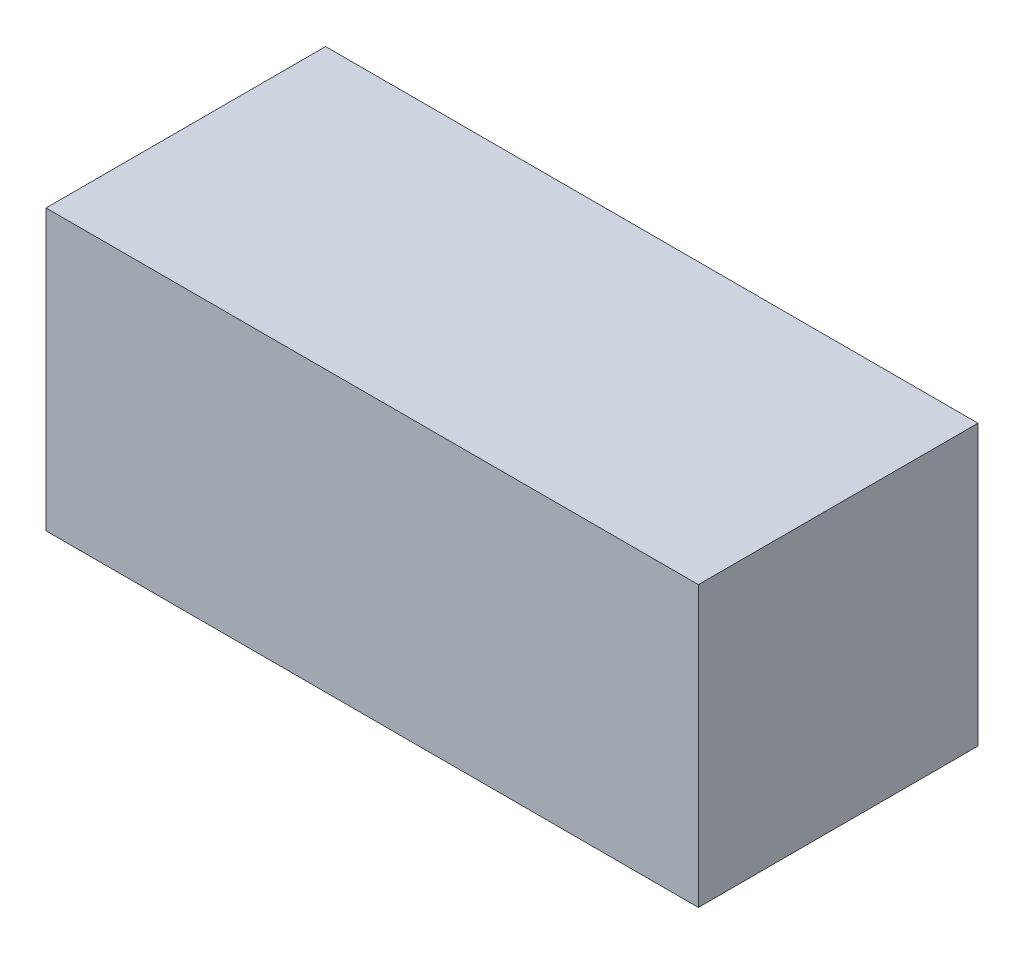
ISO-10303-21;
HEADER;
FILE_DESCRIPTION(('STEP AP214'),'2;1');
FILE_NAME('part.step','',(''),(''),'','','');
FILE_SCHEMA(('AUTOMOTIVE_DESIGN { 1 0 10303 214 1 1 1 1 }'));
ENDSEC;
DATA;
#1=APPLICATION_CONTEXT('core data for automotive mechanical design processes');
#2=APPLICATION_PROTOCOL_DEFINITION('international standard','automotive_design',2000,#1);
#3=PRODUCT_CONTEXT('',#1,'mechanical');
#4=PRODUCT('Part','Part','',(#3));
#5=PRODUCT_RELATED_PRODUCT_CATEGORY('part','',(#4));
#6=PRODUCT_DEFINITION_FORMATION('','',#4);
#7=PRODUCT_DEFINITION_CONTEXT('part definition',#1,'design');
#8=PRODUCT_DEFINITION('design','',#6,#7);
#9=PRODUCT_DEFINITION_SHAPE('','',#8);
#10=(LENGTH_UNIT() NAMED_UNIT(*) SI_UNIT(.MILLI.,.METRE.));
#11=(NAMED_UNIT(*) PLANE_ANGLE_UNIT() SI_UNIT($,.RADIAN.));
#12=(NAMED_UNIT(*) SI_UNIT($,.STERADIAN.) SOLID_ANGLE_UNIT());
#13=UNCERTAINTY_MEASURE_WITH_UNIT(LENGTH_MEASURE(1.E-05),#10,'distance_accuracy_value','');
#14=(GEOMETRIC_REPRESENTATION_CONTEXT(3) GLOBAL_UNCERTAINTY_ASSIGNED_CONTEXT((#13)) GLOBAL_UNIT_ASSIGNED_CONTEXT((#10,
#11,#12)) REPRESENTATION_CONTEXT('',''));
#15=CARTESIAN_POINT('',(0.,0.,0.));
#16=DIRECTION('',(0.,0.,1.));
#17=DIRECTION('',(1.,0.,0.));
#18=AXIS2_PLACEMENT_3D('',#15,#16,#17);
#19=CARTESIAN_POINT('',(88.9,0.,0.));
#20=DIRECTION('',(0.,0.,-1.));
#21=DIRECTION('',(-1.,0.,0.));
#22=AXIS2_PLACEMENT_3D('',#19,#20,#21);
#23=PLANE('',#22);
#24=DIRECTION('',(0.,-1.,0.));
#25=VECTOR('',#24,1.);
#26=CARTESIAN_POINT('',(0.,0.,0.));
#27=LINE('',#26,#25);
#28=CARTESIAN_POINT('',(0.,38.1,0.));
#29=VERTEX_POINT('',#28);
#30=CARTESIAN_POINT('',(0.,0.,0.));
#31=VERTEX_POINT('',#30);
#32=EDGE_CURVE('E96',#29,#31,#27,.T.);
#33=ORIENTED_EDGE('',*,*,#32,.T.);
#34=DIRECTION('',(-1.,0.,0.));
#35=VECTOR('',#34,1.);
#36=CARTESIAN_POINT('',(88.9,0.,0.));
#37=LINE('',#36,#35);
#38=CARTESIAN_POINT('',(88.9,0.,0.));
#39=VERTEX_POINT('',#38);
#40=EDGE_CURVE('E11',#39,#31,#37,.T.);
#41=ORIENTED_EDGE('',*,*,#40,.F.);
#42=DIRECTION('',(0.,-1.,0.));
#43=VECTOR('',#42,1.);
#44=CARTESIAN_POINT('',(88.9,0.,0.));
#45=LINE('',#44,#43);
#46=CARTESIAN_POINT('',(88.9,38.1,0.));
#47=VERTEX_POINT('',#46);
#48=EDGE_CURVE('E84',#47,#39,#45,.T.);
#49=ORIENTED_EDGE('',*,*,#48,.F.);
#50=DIRECTION('',(-1.,0.,0.));
#51=VECTOR('',#50,1.);
#52=CARTESIAN_POINT('',(88.9,38.1,0.));
#53=LINE('',#52,#51);
#54=EDGE_CURVE('E92',#47,#29,#53,.T.);
#55=ORIENTED_EDGE('',*,*,#54,.T.);
#56=EDGE_LOOP('',(#33,#41,#49,#55));
#57=FACE_BOUND('',#56,.T.);
#58=ADVANCED_FACE('F33',(#57),#23,.F.);
#59=CARTESIAN_POINT('',(88.9,0.,0.));
#60=DIRECTION('',(0.,1.,0.));
#61=DIRECTION('',(0.,0.,1.));
#62=AXIS2_PLACEMENT_3D('',#59,#60,#61);
#63=PLANE('',#62);
#64=DIRECTION('',(0.,0.,-1.));
#65=VECTOR('',#64,1.);
#66=CARTESIAN_POINT('',(0.,0.,0.));
#67=LINE('',#66,#65);
#68=CARTESIAN_POINT('',(0.,0.,-38.1));
#69=VERTEX_POINT('',#68);
#70=EDGE_CURVE('E88',#31,#69,#67,.T.);
#71=ORIENTED_EDGE('',*,*,#70,.T.);
#72=DIRECTION('',(-1.,0.,0.));
#73=VECTOR('',#72,1.);
#74=CARTESIAN_POINT('',(88.9,0.,-38.1));
#75=LINE('',#74,#73);
#76=CARTESIAN_POINT('',(88.9,0.,-38.1));
#77=VERTEX_POINT('',#76);
#78=EDGE_CURVE('E41',#77,#69,#75,.T.);
#79=ORIENTED_EDGE('',*,*,#78,.F.);
#80=DIRECTION('',(0.,0.,-1.));
#81=VECTOR('',#80,1.);
#82=CARTESIAN_POINT('',(88.9,0.,0.));
#83=LINE('',#82,#81);
#84=EDGE_CURVE('E79',#39,#77,#83,.T.);
#85=ORIENTED_EDGE('',*,*,#84,.F.);
#86=ORIENTED_EDGE('',*,*,#40,.T.);
#87=EDGE_LOOP('',(#71,#79,#85,#86));
#88=FACE_BOUND('',#87,.T.);
#89=ADVANCED_FACE('F87',(#88),#63,.F.);
#90=CARTESIAN_POINT('',(88.9,0.,-38.1));
#91=DIRECTION('',(0.,0.,1.));
#92=DIRECTION('',(1.,0.,0.));
#93=AXIS2_PLACEMENT_3D('',#90,#91,#92);
#94=PLANE('',#93);
#95=DIRECTION('',(0.,1.,0.));
#96=VECTOR('',#95,1.);
#97=CARTESIAN_POINT('',(0.,0.,-38.1));
#98=LINE('',#97,#96);
#99=CARTESIAN_POINT('',(0.,38.1,-38.1));
#100=VERTEX_POINT('',#99);
#101=EDGE_CURVE('E66',#69,#100,#98,.T.);
#102=ORIENTED_EDGE('',*,*,#101,.T.);
#103=DIRECTION('',(-1.,0.,0.));
#104=VECTOR('',#103,1.);
#105=CARTESIAN_POINT('',(88.9,38.1,-38.1));
#106=LINE('',#105,#104);
#107=CARTESIAN_POINT('',(88.9,38.1,-38.1));
#108=VERTEX_POINT('',#107);
#109=EDGE_CURVE('E89',#108,#100,#106,.T.);
#110=ORIENTED_EDGE('',*,*,#109,.F.);
#111=DIRECTION('',(0.,1.,0.));
#112=VECTOR('',#111,1.);
#113=CARTESIAN_POINT('',(88.9,0.,-38.1));
#114=LINE('',#113,#112);
#115=EDGE_CURVE('E82',#77,#108,#114,.T.);
#116=ORIENTED_EDGE('',*,*,#115,.F.);
#117=ORIENTED_EDGE('',*,*,#78,.T.);
#118=EDGE_LOOP('',(#102,#110,#116,#117));
#119=FACE_BOUND('',#118,.T.);
#120=ADVANCED_FACE('F90',(#119),#94,.F.);
#121=CARTESIAN_POINT('',(88.9,38.1,0.));
#122=DIRECTION('',(0.,-1.,0.));
#123=DIRECTION('',(0.,0.,-1.));
#124=AXIS2_PLACEMENT_3D('',#121,#122,#123);
#125=PLANE('',#124);
#126=DIRECTION('',(0.,0.,1.));
#127=VECTOR('',#126,1.);
#128=CARTESIAN_POINT('',(0.,38.1,0.));
#129=LINE('',#128,#127);
#130=EDGE_CURVE('E72',#100,#29,#129,.T.);
#131=ORIENTED_EDGE('',*,*,#130,.T.);
#132=ORIENTED_EDGE('',*,*,#54,.F.);
#133=DIRECTION('',(0.,0.,1.));
#134=VECTOR('',#133,1.);
#135=CARTESIAN_POINT('',(88.9,38.1,0.));
#136=LINE('',#135,#134);
#137=EDGE_CURVE('E49',#108,#47,#136,.T.);
#138=ORIENTED_EDGE('',*,*,#137,.F.);
#139=ORIENTED_EDGE('',*,*,#109,.T.);
#140=EDGE_LOOP('',(#131,#132,#138,#139));
#141=FACE_BOUND('',#140,.T.);
#142=ADVANCED_FACE('F103',(#141),#125,.F.);
#143=CARTESIAN_POINT('',(88.9,0.,0.));
#144=DIRECTION('',(-1.,0.,0.));
#145=DIRECTION('',(0.,0.,1.));
#146=AXIS2_PLACEMENT_3D('',#143,#144,#145);
#147=PLANE('',#146);
#148=ORIENTED_EDGE('',*,*,#48,.T.);
#149=ORIENTED_EDGE('',*,*,#84,.T.);
#150=ORIENTED_EDGE('',*,*,#115,.T.);
#151=ORIENTED_EDGE('',*,*,#137,.T.);
#152=EDGE_LOOP('',(#148,#149,#150,#151));
#153=FACE_BOUND('',#152,.T.);
#154=ADVANCED_FACE('F80',(#153),#147,.F.);
#155=CARTESIAN_POINT('',(0.,0.,0.));
#156=DIRECTION('',(-1.,0.,0.));
#157=DIRECTION('',(0.,0.,1.));
#158=AXIS2_PLACEMENT_3D('',#155,#156,#157);
#159=PLANE('',#158);
#160=ORIENTED_EDGE('',*,*,#32,.F.);
#161=ORIENTED_EDGE('',*,*,#130,.F.);
#162=ORIENTED_EDGE('',*,*,#101,.F.);
#163=ORIENTED_EDGE('',*,*,#70,.F.);
#164=EDGE_LOOP('',(#160,#161,#162,#163));
#165=FACE_BOUND('',#164,.T.);
#166=ADVANCED_FACE('F106',(#165),#159,.T.);
#167=CLOSED_SHELL('',(#58,#89,#120,#142,#154,#166));
#168=MANIFOLD_SOLID_BREP('B2',#167);
#169=ADVANCED_BREP_SHAPE_REPRESENTATION('',(#18,#168),#14);
#170=SHAPE_DEFINITION_REPRESENTATION(#9,#169);
ENDSEC;
END-ISO-10303-21;
